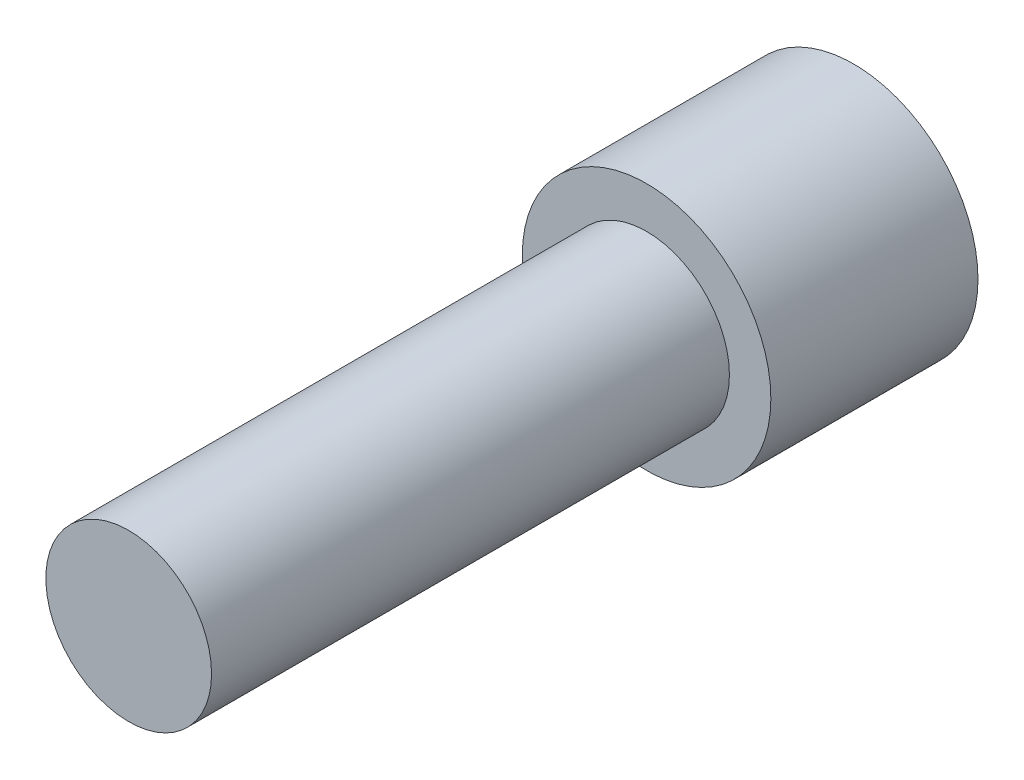
ISO-10303-21;
HEADER;
FILE_DESCRIPTION(('STEP AP214'),'2;1');
FILE_NAME('part.step','',(''),(''),'','','');
FILE_SCHEMA(('AUTOMOTIVE_DESIGN { 1 0 10303 214 1 1 1 1 }'));
ENDSEC;
DATA;
#1=APPLICATION_CONTEXT('core data for automotive mechanical design processes');
#2=APPLICATION_PROTOCOL_DEFINITION('international standard','automotive_design',2000,#1);
#3=PRODUCT_CONTEXT('',#1,'mechanical');
#4=PRODUCT('Part','Part','',(#3));
#5=PRODUCT_RELATED_PRODUCT_CATEGORY('part','',(#4));
#6=PRODUCT_DEFINITION_FORMATION('','',#4);
#7=PRODUCT_DEFINITION_CONTEXT('part definition',#1,'design');
#8=PRODUCT_DEFINITION('design','',#6,#7);
#9=PRODUCT_DEFINITION_SHAPE('','',#8);
#10=(LENGTH_UNIT() NAMED_UNIT(*) SI_UNIT(.MILLI.,.METRE.));
#11=(NAMED_UNIT(*) PLANE_ANGLE_UNIT() SI_UNIT($,.RADIAN.));
#12=(NAMED_UNIT(*) SI_UNIT($,.STERADIAN.) SOLID_ANGLE_UNIT());
#13=UNCERTAINTY_MEASURE_WITH_UNIT(LENGTH_MEASURE(1.E-05),#10,'distance_accuracy_value','');
#14=(GEOMETRIC_REPRESENTATION_CONTEXT(3) GLOBAL_UNCERTAINTY_ASSIGNED_CONTEXT((#13)) GLOBAL_UNIT_ASSIGNED_CONTEXT((#10,
#11,#12)) REPRESENTATION_CONTEXT('',''));
#15=CARTESIAN_POINT('',(0.,0.,0.));
#16=DIRECTION('',(0.,0.,1.));
#17=DIRECTION('',(1.,0.,0.));
#18=AXIS2_PLACEMENT_3D('',#15,#16,#17);
#19=CARTESIAN_POINT('',(0.,0.,10.));
#20=DIRECTION('',(0.,0.,-1.));
#21=DIRECTION('',(-1.,0.,0.));
#22=AXIS2_PLACEMENT_3D('',#19,#20,#21);
#23=CYLINDRICAL_SURFACE('',#22,6.);
#24=CARTESIAN_POINT('',(0.,0.,10.));
#25=DIRECTION('',(0.,0.,1.));
#26=DIRECTION('',(1.,0.,0.));
#27=AXIS2_PLACEMENT_3D('',#24,#25,#26);
#28=CIRCLE('',#27,6.);
#29=CARTESIAN_POINT('',(6.,0.,10.));
#30=VERTEX_POINT('',#29);
#31=EDGE_CURVE('E54',#30,#30,#28,.T.);
#32=ORIENTED_EDGE('',*,*,#31,.F.);
#33=EDGE_LOOP('',(#32));
#34=FACE_BOUND('',#33,.T.);
#35=CARTESIAN_POINT('',(0.,0.,0.));
#36=DIRECTION('',(0.,0.,1.));
#37=DIRECTION('',(1.,0.,0.));
#38=AXIS2_PLACEMENT_3D('',#35,#36,#37);
#39=CIRCLE('',#38,6.);
#40=CARTESIAN_POINT('',(6.,0.,0.));
#41=VERTEX_POINT('',#40);
#42=EDGE_CURVE('E48',#41,#41,#39,.T.);
#43=ORIENTED_EDGE('',*,*,#42,.T.);
#44=EDGE_LOOP('',(#43));
#45=FACE_BOUND('',#44,.T.);
#46=ADVANCED_FACE('F45',(#34,#45),#23,.T.);
#47=CARTESIAN_POINT('',(0.,0.,10.));
#48=DIRECTION('',(0.,0.,1.));
#49=DIRECTION('',(1.,0.,0.));
#50=AXIS2_PLACEMENT_3D('',#47,#48,#49);
#51=PLANE('',#50);
#52=CARTESIAN_POINT('',(0.,0.,10.));
#53=DIRECTION('',(0.,0.,1.));
#54=DIRECTION('',(1.,0.,0.));
#55=AXIS2_PLACEMENT_3D('',#52,#53,#54);
#56=CIRCLE('',#55,4.);
#57=CARTESIAN_POINT('',(4.,0.,10.));
#58=VERTEX_POINT('',#57);
#59=EDGE_CURVE('E11',#58,#58,#56,.T.);
#60=ORIENTED_EDGE('',*,*,#59,.F.);
#61=EDGE_LOOP('',(#60));
#62=FACE_BOUND('',#61,.T.);
#63=ORIENTED_EDGE('',*,*,#31,.T.);
#64=EDGE_LOOP('',(#63));
#65=FACE_BOUND('',#64,.T.);
#66=ADVANCED_FACE('F185',(#62,#65),#51,.T.);
#67=CARTESIAN_POINT('',(0.,0.,0.));
#68=DIRECTION('',(0.,0.,1.));
#69=DIRECTION('',(1.,0.,0.));
#70=AXIS2_PLACEMENT_3D('',#67,#68,#69);
#71=PLANE('',#70);
#72=DIRECTION('',(1.,0.,0.));
#73=VECTOR('',#72,1.);
#74=CARTESIAN_POINT('',(-2.3094010767585,4.,0.));
#75=LINE('',#74,#73);
#76=CARTESIAN_POINT('',(-2.3094010767585,4.,0.));
#77=VERTEX_POINT('',#76);
#78=CARTESIAN_POINT('',(2.3094010767585,4.,0.));
#79=VERTEX_POINT('',#78);
#80=EDGE_CURVE('E142',#77,#79,#75,.T.);
#81=ORIENTED_EDGE('',*,*,#80,.F.);
#82=DIRECTION('',(0.5,0.866025403784438,0.));
#83=VECTOR('',#82,1.);
#84=CARTESIAN_POINT('',(-4.61880215351701,0.,0.));
#85=LINE('',#84,#83);
#86=CARTESIAN_POINT('',(-4.61880215351701,0.,0.));
#87=VERTEX_POINT('',#86);
#88=EDGE_CURVE('E62',#87,#77,#85,.T.);
#89=ORIENTED_EDGE('',*,*,#88,.F.);
#90=DIRECTION('',(-0.5,0.866025403784439,0.));
#91=VECTOR('',#90,1.);
#92=CARTESIAN_POINT('',(-2.3094010767585,-4.,0.));
#93=LINE('',#92,#91);
#94=CARTESIAN_POINT('',(-2.3094010767585,-4.,0.));
#95=VERTEX_POINT('',#94);
#96=EDGE_CURVE('E155',#95,#87,#93,.T.);
#97=ORIENTED_EDGE('',*,*,#96,.F.);
#98=DIRECTION('',(-1.,0.,0.));
#99=VECTOR('',#98,1.);
#100=CARTESIAN_POINT('',(2.3094010767585,-4.,0.));
#101=LINE('',#100,#99);
#102=CARTESIAN_POINT('',(2.3094010767585,-4.,0.));
#103=VERTEX_POINT('',#102);
#104=EDGE_CURVE('E152',#103,#95,#101,.T.);
#105=ORIENTED_EDGE('',*,*,#104,.F.);
#106=DIRECTION('',(-0.5,-0.866025403784439,0.));
#107=VECTOR('',#106,1.);
#108=CARTESIAN_POINT('',(4.61880215351701,0.,0.));
#109=LINE('',#108,#107);
#110=CARTESIAN_POINT('',(4.61880215351701,0.,0.));
#111=VERTEX_POINT('',#110);
#112=EDGE_CURVE('E110',#111,#103,#109,.T.);
#113=ORIENTED_EDGE('',*,*,#112,.F.);
#114=DIRECTION('',(0.5,-0.866025403784438,0.));
#115=VECTOR('',#114,1.);
#116=CARTESIAN_POINT('',(2.3094010767585,4.,0.));
#117=LINE('',#116,#115);
#118=EDGE_CURVE('E146',#79,#111,#117,.T.);
#119=ORIENTED_EDGE('',*,*,#118,.F.);
#120=EDGE_LOOP('',(#81,#89,#97,#105,#113,#119));
#121=FACE_BOUND('',#120,.T.);
#122=ORIENTED_EDGE('',*,*,#42,.F.);
#123=EDGE_LOOP('',(#122));
#124=FACE_BOUND('',#123,.T.);
#125=ADVANCED_FACE('F182',(#121,#124),#71,.F.);
#126=CARTESIAN_POINT('',(0.,0.,35.));
#127=DIRECTION('',(0.,0.,-1.));
#128=DIRECTION('',(-1.,0.,0.));
#129=AXIS2_PLACEMENT_3D('',#126,#127,#128);
#130=CYLINDRICAL_SURFACE('',#129,4.);
#131=CARTESIAN_POINT('',(0.,0.,35.));
#132=DIRECTION('',(0.,0.,1.));
#133=DIRECTION('',(1.,0.,0.));
#134=AXIS2_PLACEMENT_3D('',#131,#132,#133);
#135=CIRCLE('',#134,4.);
#136=CARTESIAN_POINT('',(4.,0.,35.));
#137=VERTEX_POINT('',#136);
#138=EDGE_CURVE('E161',#137,#137,#135,.T.);
#139=ORIENTED_EDGE('',*,*,#138,.F.);
#140=EDGE_LOOP('',(#139));
#141=FACE_BOUND('',#140,.T.);
#142=ORIENTED_EDGE('',*,*,#59,.T.);
#143=EDGE_LOOP('',(#142));
#144=FACE_BOUND('',#143,.T.);
#145=ADVANCED_FACE('F184',(#141,#144),#130,.T.);
#146=CARTESIAN_POINT('',(0.,0.,35.));
#147=DIRECTION('',(0.,0.,1.));
#148=DIRECTION('',(1.,0.,0.));
#149=AXIS2_PLACEMENT_3D('',#146,#147,#148);
#150=PLANE('',#149);
#151=ORIENTED_EDGE('',*,*,#138,.T.);
#152=EDGE_LOOP('',(#151));
#153=FACE_BOUND('',#152,.T.);
#154=ADVANCED_FACE('F192',(#153),#150,.T.);
#155=CARTESIAN_POINT('',(-4.61880215351701,0.,7.));
#156=DIRECTION('',(-0.866025403784438,0.5,0.));
#157=DIRECTION('',(-0.5,-0.866025403784439,0.));
#158=AXIS2_PLACEMENT_3D('',#155,#156,#157);
#159=PLANE('',#158);
#160=ORIENTED_EDGE('',*,*,#88,.T.);
#161=DIRECTION('',(0.,0.,-1.));
#162=VECTOR('',#161,1.);
#163=CARTESIAN_POINT('',(-2.3094010767585,4.,7.));
#164=LINE('',#163,#162);
#165=CARTESIAN_POINT('',(-2.3094010767585,4.,7.));
#166=VERTEX_POINT('',#165);
#167=EDGE_CURVE('E92',#166,#77,#164,.T.);
#168=ORIENTED_EDGE('',*,*,#167,.F.);
#169=DIRECTION('',(0.5,0.866025403784438,0.));
#170=VECTOR('',#169,1.);
#171=CARTESIAN_POINT('',(-4.61880215351701,0.,7.));
#172=LINE('',#171,#170);
#173=CARTESIAN_POINT('',(-4.61880215351701,0.,7.));
#174=VERTEX_POINT('',#173);
#175=EDGE_CURVE('E158',#174,#166,#172,.T.);
#176=ORIENTED_EDGE('',*,*,#175,.F.);
#177=DIRECTION('',(0.,0.,-1.));
#178=VECTOR('',#177,1.);
#179=CARTESIAN_POINT('',(-4.61880215351701,0.,7.));
#180=LINE('',#179,#178);
#181=EDGE_CURVE('E70',#174,#87,#180,.T.);
#182=ORIENTED_EDGE('',*,*,#181,.T.);
#183=EDGE_LOOP('',(#160,#168,#176,#182));
#184=FACE_BOUND('',#183,.T.);
#185=ADVANCED_FACE('F218',(#184),#159,.F.);
#186=CARTESIAN_POINT('',(-2.3094010767585,-4.,7.));
#187=DIRECTION('',(-0.866025403784439,-0.5,0.));
#188=DIRECTION('',(0.5,-0.866025403784439,0.));
#189=AXIS2_PLACEMENT_3D('',#186,#187,#188);
#190=PLANE('',#189);
#191=ORIENTED_EDGE('',*,*,#96,.T.);
#192=ORIENTED_EDGE('',*,*,#181,.F.);
#193=DIRECTION('',(-0.5,0.866025403784439,0.));
#194=VECTOR('',#193,1.);
#195=CARTESIAN_POINT('',(-2.3094010767585,-4.,7.));
#196=LINE('',#195,#194);
#197=CARTESIAN_POINT('',(-2.3094010767585,-4.,7.));
#198=VERTEX_POINT('',#197);
#199=EDGE_CURVE('E124',#198,#174,#196,.T.);
#200=ORIENTED_EDGE('',*,*,#199,.F.);
#201=DIRECTION('',(0.,0.,-1.));
#202=VECTOR('',#201,1.);
#203=CARTESIAN_POINT('',(-2.3094010767585,-4.,7.));
#204=LINE('',#203,#202);
#205=EDGE_CURVE('E115',#198,#95,#204,.T.);
#206=ORIENTED_EDGE('',*,*,#205,.T.);
#207=EDGE_LOOP('',(#191,#192,#200,#206));
#208=FACE_BOUND('',#207,.T.);
#209=ADVANCED_FACE('F230',(#208),#190,.F.);
#210=CARTESIAN_POINT('',(2.3094010767585,-4.,7.));
#211=DIRECTION('',(0.,-1.,0.));
#212=DIRECTION('',(0.,0.,-1.));
#213=AXIS2_PLACEMENT_3D('',#210,#211,#212);
#214=PLANE('',#213);
#215=ORIENTED_EDGE('',*,*,#104,.T.);
#216=ORIENTED_EDGE('',*,*,#205,.F.);
#217=DIRECTION('',(-1.,0.,0.));
#218=VECTOR('',#217,1.);
#219=CARTESIAN_POINT('',(2.3094010767585,-4.,7.));
#220=LINE('',#219,#218);
#221=CARTESIAN_POINT('',(2.3094010767585,-4.,7.));
#222=VERTEX_POINT('',#221);
#223=EDGE_CURVE('E119',#222,#198,#220,.T.);
#224=ORIENTED_EDGE('',*,*,#223,.F.);
#225=DIRECTION('',(0.,0.,-1.));
#226=VECTOR('',#225,1.);
#227=CARTESIAN_POINT('',(2.3094010767585,-4.,7.));
#228=LINE('',#227,#226);
#229=EDGE_CURVE('E103',#222,#103,#228,.T.);
#230=ORIENTED_EDGE('',*,*,#229,.T.);
#231=EDGE_LOOP('',(#215,#216,#224,#230));
#232=FACE_BOUND('',#231,.T.);
#233=ADVANCED_FACE('F120',(#232),#214,.F.);
#234=CARTESIAN_POINT('',(4.61880215351701,0.,7.));
#235=DIRECTION('',(0.866025403784439,-0.5,0.));
#236=DIRECTION('',(0.5,0.866025403784439,0.));
#237=AXIS2_PLACEMENT_3D('',#234,#235,#236);
#238=PLANE('',#237);
#239=ORIENTED_EDGE('',*,*,#112,.T.);
#240=ORIENTED_EDGE('',*,*,#229,.F.);
#241=DIRECTION('',(-0.5,-0.866025403784439,0.));
#242=VECTOR('',#241,1.);
#243=CARTESIAN_POINT('',(4.61880215351701,0.,7.));
#244=LINE('',#243,#242);
#245=CARTESIAN_POINT('',(4.61880215351701,0.,7.));
#246=VERTEX_POINT('',#245);
#247=EDGE_CURVE('E107',#246,#222,#244,.T.);
#248=ORIENTED_EDGE('',*,*,#247,.F.);
#249=DIRECTION('',(0.,0.,-1.));
#250=VECTOR('',#249,1.);
#251=CARTESIAN_POINT('',(4.61880215351701,0.,7.));
#252=LINE('',#251,#250);
#253=EDGE_CURVE('E116',#246,#111,#252,.T.);
#254=ORIENTED_EDGE('',*,*,#253,.T.);
#255=EDGE_LOOP('',(#239,#240,#248,#254));
#256=FACE_BOUND('',#255,.T.);
#257=ADVANCED_FACE('F105',(#256),#238,.F.);
#258=CARTESIAN_POINT('',(2.3094010767585,4.,7.));
#259=DIRECTION('',(0.866025403784438,0.5,0.));
#260=DIRECTION('',(-0.5,0.866025403784439,0.));
#261=AXIS2_PLACEMENT_3D('',#258,#259,#260);
#262=PLANE('',#261);
#263=ORIENTED_EDGE('',*,*,#118,.T.);
#264=ORIENTED_EDGE('',*,*,#253,.F.);
#265=DIRECTION('',(0.5,-0.866025403784438,0.));
#266=VECTOR('',#265,1.);
#267=CARTESIAN_POINT('',(2.3094010767585,4.,7.));
#268=LINE('',#267,#266);
#269=CARTESIAN_POINT('',(2.3094010767585,4.,7.));
#270=VERTEX_POINT('',#269);
#271=EDGE_CURVE('E130',#270,#246,#268,.T.);
#272=ORIENTED_EDGE('',*,*,#271,.F.);
#273=DIRECTION('',(0.,0.,-1.));
#274=VECTOR('',#273,1.);
#275=CARTESIAN_POINT('',(2.3094010767585,4.,7.));
#276=LINE('',#275,#274);
#277=EDGE_CURVE('E166',#270,#79,#276,.T.);
#278=ORIENTED_EDGE('',*,*,#277,.T.);
#279=EDGE_LOOP('',(#263,#264,#272,#278));
#280=FACE_BOUND('',#279,.T.);
#281=ADVANCED_FACE('F255',(#280),#262,.F.);
#282=CARTESIAN_POINT('',(-2.3094010767585,4.,7.));
#283=DIRECTION('',(0.,1.,0.));
#284=DIRECTION('',(-1.,0.,0.));
#285=AXIS2_PLACEMENT_3D('',#282,#283,#284);
#286=PLANE('',#285);
#287=ORIENTED_EDGE('',*,*,#80,.T.);
#288=ORIENTED_EDGE('',*,*,#277,.F.);
#289=DIRECTION('',(1.,0.,0.));
#290=VECTOR('',#289,1.);
#291=CARTESIAN_POINT('',(-2.3094010767585,4.,7.));
#292=LINE('',#291,#290);
#293=EDGE_CURVE('E134',#166,#270,#292,.T.);
#294=ORIENTED_EDGE('',*,*,#293,.F.);
#295=ORIENTED_EDGE('',*,*,#167,.T.);
#296=EDGE_LOOP('',(#287,#288,#294,#295));
#297=FACE_BOUND('',#296,.T.);
#298=ADVANCED_FACE('F264',(#297),#286,.F.);
#299=CARTESIAN_POINT('',(0.,0.,7.));
#300=DIRECTION('',(0.,0.,-1.));
#301=DIRECTION('',(-1.,0.,0.));
#302=AXIS2_PLACEMENT_3D('',#299,#300,#301);
#303=PLANE('',#302);
#304=ORIENTED_EDGE('',*,*,#175,.T.);
#305=ORIENTED_EDGE('',*,*,#293,.T.);
#306=ORIENTED_EDGE('',*,*,#271,.T.);
#307=ORIENTED_EDGE('',*,*,#247,.T.);
#308=ORIENTED_EDGE('',*,*,#223,.T.);
#309=ORIENTED_EDGE('',*,*,#199,.T.);
#310=EDGE_LOOP('',(#304,#305,#306,#307,#308,#309));
#311=FACE_BOUND('',#310,.T.);
#312=ADVANCED_FACE('F127',(#311),#303,.T.);
#313=CLOSED_SHELL('',(#46,#66,#125,#145,#154,#185,#209,#233,#257,#281,#298,#312));
#314=MANIFOLD_SOLID_BREP('B2',#313);
#315=ADVANCED_BREP_SHAPE_REPRESENTATION('',(#18,#314),#14);
#316=SHAPE_DEFINITION_REPRESENTATION(#9,#315);
ENDSEC;
END-ISO-10303-21;
